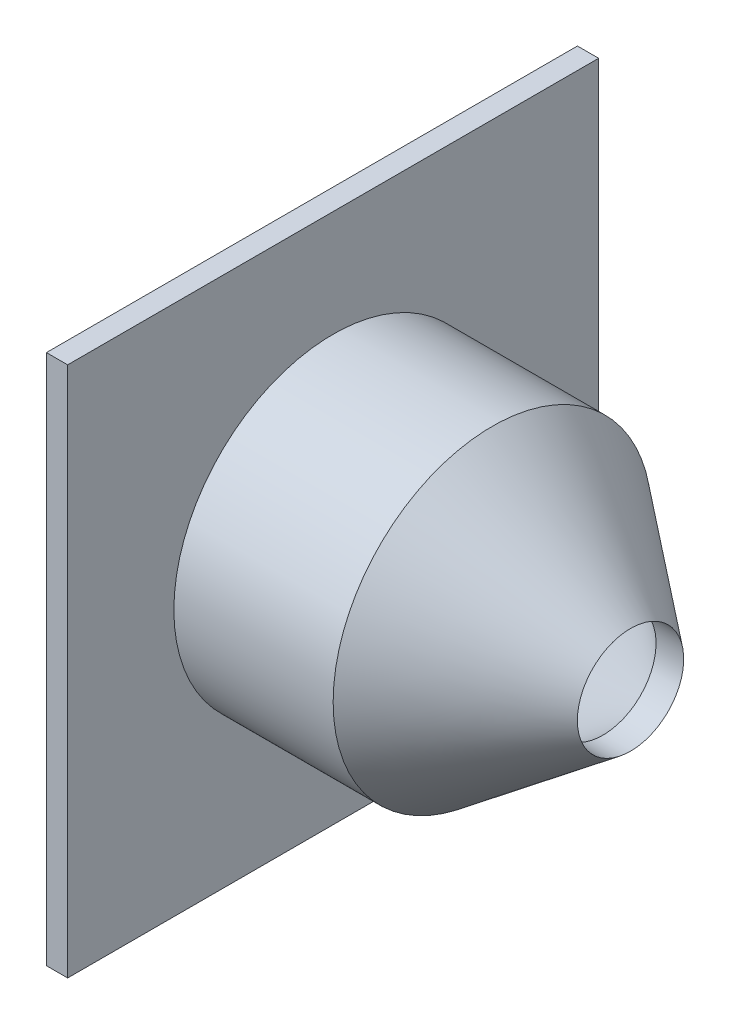
ISO-10303-21;
HEADER;
FILE_DESCRIPTION(('STEP AP214'),'2;1');
FILE_NAME('part.step','',(''),(''),'','','');
FILE_SCHEMA(('AUTOMOTIVE_DESIGN { 1 0 10303 214 1 1 1 1 }'));
ENDSEC;
DATA;
#1=APPLICATION_CONTEXT('core data for automotive mechanical design processes');
#2=APPLICATION_PROTOCOL_DEFINITION('international standard','automotive_design',2000,#1);
#3=PRODUCT_CONTEXT('',#1,'mechanical');
#4=PRODUCT('Part','Part','',(#3));
#5=PRODUCT_RELATED_PRODUCT_CATEGORY('part','',(#4));
#6=PRODUCT_DEFINITION_FORMATION('','',#4);
#7=PRODUCT_DEFINITION_CONTEXT('part definition',#1,'design');
#8=PRODUCT_DEFINITION('design','',#6,#7);
#9=PRODUCT_DEFINITION_SHAPE('','',#8);
#10=(LENGTH_UNIT() NAMED_UNIT(*) SI_UNIT(.MILLI.,.METRE.));
#11=(NAMED_UNIT(*) PLANE_ANGLE_UNIT() SI_UNIT($,.RADIAN.));
#12=(NAMED_UNIT(*) SI_UNIT($,.STERADIAN.) SOLID_ANGLE_UNIT());
#13=UNCERTAINTY_MEASURE_WITH_UNIT(LENGTH_MEASURE(1.E-05),#10,'distance_accuracy_value','');
#14=(GEOMETRIC_REPRESENTATION_CONTEXT(3) GLOBAL_UNCERTAINTY_ASSIGNED_CONTEXT((#13)) GLOBAL_UNIT_ASSIGNED_CONTEXT((#10,
#11,#12)) REPRESENTATION_CONTEXT('',''));
#15=CARTESIAN_POINT('',(0.,0.,0.));
#16=DIRECTION('',(0.,0.,1.));
#17=DIRECTION('',(1.,0.,0.));
#18=AXIS2_PLACEMENT_3D('',#15,#16,#17);
#19=CARTESIAN_POINT('',(2.,0.,-25.));
#20=DIRECTION('',(0.,0.,-1.));
#21=DIRECTION('',(0.,1.,0.));
#22=AXIS2_PLACEMENT_3D('',#19,#20,#21);
#23=PLANE('',#22);
#24=DIRECTION('',(0.,-1.,0.));
#25=VECTOR('',#24,1.);
#26=CARTESIAN_POINT('',(0.,0.,-25.));
#27=LINE('',#26,#25);
#28=CARTESIAN_POINT('',(0.,25.,-25.));
#29=VERTEX_POINT('',#28);
#30=CARTESIAN_POINT('',(0.,-25.,-25.));
#31=VERTEX_POINT('',#30);
#32=EDGE_CURVE('E116',#29,#31,#27,.T.);
#33=ORIENTED_EDGE('',*,*,#32,.F.);
#34=DIRECTION('',(-1.,0.,0.));
#35=VECTOR('',#34,1.);
#36=CARTESIAN_POINT('',(2.,25.,-25.));
#37=LINE('',#36,#35);
#38=CARTESIAN_POINT('',(2.,25.,-25.));
#39=VERTEX_POINT('',#38);
#40=EDGE_CURVE('E12',#39,#29,#37,.T.);
#41=ORIENTED_EDGE('',*,*,#40,.F.);
#42=DIRECTION('',(0.,-1.,0.));
#43=VECTOR('',#42,1.);
#44=CARTESIAN_POINT('',(2.,0.,-25.));
#45=LINE('',#44,#43);
#46=CARTESIAN_POINT('',(2.,-25.,-25.));
#47=VERTEX_POINT('',#46);
#48=EDGE_CURVE('E106',#39,#47,#45,.T.);
#49=ORIENTED_EDGE('',*,*,#48,.T.);
#50=DIRECTION('',(-1.,0.,0.));
#51=VECTOR('',#50,1.);
#52=CARTESIAN_POINT('',(2.,-25.,-25.));
#53=LINE('',#52,#51);
#54=EDGE_CURVE('E85',#47,#31,#53,.T.);
#55=ORIENTED_EDGE('',*,*,#54,.T.);
#56=EDGE_LOOP('',(#33,#41,#49,#55));
#57=FACE_BOUND('',#56,.T.);
#58=ADVANCED_FACE('F45',(#57),#23,.T.);
#59=CARTESIAN_POINT('',(2.,25.,0.));
#60=DIRECTION('',(0.,1.,0.));
#61=DIRECTION('',(0.,0.,1.));
#62=AXIS2_PLACEMENT_3D('',#59,#60,#61);
#63=PLANE('',#62);
#64=DIRECTION('',(0.,0.,-1.));
#65=VECTOR('',#64,1.);
#66=CARTESIAN_POINT('',(0.,25.,0.));
#67=LINE('',#66,#65);
#68=CARTESIAN_POINT('',(0.,25.,25.));
#69=VERTEX_POINT('',#68);
#70=EDGE_CURVE('E97',#69,#29,#67,.T.);
#71=ORIENTED_EDGE('',*,*,#70,.F.);
#72=DIRECTION('',(-1.,0.,0.));
#73=VECTOR('',#72,1.);
#74=CARTESIAN_POINT('',(2.,25.,25.));
#75=LINE('',#74,#73);
#76=CARTESIAN_POINT('',(2.,25.,25.));
#77=VERTEX_POINT('',#76);
#78=EDGE_CURVE('E54',#77,#69,#75,.T.);
#79=ORIENTED_EDGE('',*,*,#78,.F.);
#80=DIRECTION('',(0.,0.,-1.));
#81=VECTOR('',#80,1.);
#82=CARTESIAN_POINT('',(2.,25.,0.));
#83=LINE('',#82,#81);
#84=EDGE_CURVE('E95',#77,#39,#83,.T.);
#85=ORIENTED_EDGE('',*,*,#84,.T.);
#86=ORIENTED_EDGE('',*,*,#40,.T.);
#87=EDGE_LOOP('',(#71,#79,#85,#86));
#88=FACE_BOUND('',#87,.T.);
#89=ADVANCED_FACE('F93',(#88),#63,.T.);
#90=CARTESIAN_POINT('',(2.,0.,25.));
#91=DIRECTION('',(0.,0.,-1.));
#92=DIRECTION('',(-1.,0.,0.));
#93=AXIS2_PLACEMENT_3D('',#90,#91,#92);
#94=PLANE('',#93);
#95=DIRECTION('',(0.,-1.,0.));
#96=VECTOR('',#95,1.);
#97=CARTESIAN_POINT('',(0.,0.,25.));
#98=LINE('',#97,#96);
#99=CARTESIAN_POINT('',(0.,-25.,25.));
#100=VERTEX_POINT('',#99);
#101=EDGE_CURVE('E119',#69,#100,#98,.T.);
#102=ORIENTED_EDGE('',*,*,#101,.T.);
#103=DIRECTION('',(-1.,0.,0.));
#104=VECTOR('',#103,1.);
#105=CARTESIAN_POINT('',(2.,-25.,25.));
#106=LINE('',#105,#104);
#107=CARTESIAN_POINT('',(2.,-25.,25.));
#108=VERTEX_POINT('',#107);
#109=EDGE_CURVE('E100',#108,#100,#106,.T.);
#110=ORIENTED_EDGE('',*,*,#109,.F.);
#111=DIRECTION('',(0.,-1.,0.));
#112=VECTOR('',#111,1.);
#113=CARTESIAN_POINT('',(2.,0.,25.));
#114=LINE('',#113,#112);
#115=EDGE_CURVE('E102',#77,#108,#114,.T.);
#116=ORIENTED_EDGE('',*,*,#115,.F.);
#117=ORIENTED_EDGE('',*,*,#78,.T.);
#118=EDGE_LOOP('',(#102,#110,#116,#117));
#119=FACE_BOUND('',#118,.T.);
#120=ADVANCED_FACE('F103',(#119),#94,.F.);
#121=CARTESIAN_POINT('',(2.,0.,0.));
#122=DIRECTION('',(-1.,0.,0.));
#123=DIRECTION('',(0.,0.,1.));
#124=AXIS2_PLACEMENT_3D('',#121,#122,#123);
#125=CYLINDRICAL_SURFACE('',#124,15.);
#126=CARTESIAN_POINT('',(2.,0.,0.));
#127=DIRECTION('',(1.,0.,0.));
#128=DIRECTION('',(0.,0.,-1.));
#129=AXIS2_PLACEMENT_3D('',#126,#127,#128);
#130=CIRCLE('',#129,15.);
#131=CARTESIAN_POINT('',(2.,0.,-15.));
#132=VERTEX_POINT('',#131);
#133=EDGE_CURVE('E108',#132,#132,#130,.T.);
#134=ORIENTED_EDGE('',*,*,#133,.T.);
#135=EDGE_LOOP('',(#134));
#136=FACE_BOUND('',#135,.T.);
#137=CARTESIAN_POINT('',(0.,0.,0.));
#138=DIRECTION('',(1.,0.,0.));
#139=DIRECTION('',(0.,0.,-1.));
#140=AXIS2_PLACEMENT_3D('',#137,#138,#139);
#141=CIRCLE('',#140,15.);
#142=CARTESIAN_POINT('',(0.,0.,-15.));
#143=VERTEX_POINT('',#142);
#144=EDGE_CURVE('E113',#143,#143,#141,.T.);
#145=ORIENTED_EDGE('',*,*,#144,.F.);
#146=EDGE_LOOP('',(#145));
#147=FACE_BOUND('',#146,.T.);
#148=ADVANCED_FACE('F47',(#136,#147),#125,.F.);
#149=CARTESIAN_POINT('',(2.,-25.,0.));
#150=DIRECTION('',(0.,1.,0.));
#151=DIRECTION('',(0.,0.,1.));
#152=AXIS2_PLACEMENT_3D('',#149,#150,#151);
#153=PLANE('',#152);
#154=DIRECTION('',(0.,0.,-1.));
#155=VECTOR('',#154,1.);
#156=CARTESIAN_POINT('',(0.,-25.,0.));
#157=LINE('',#156,#155);
#158=EDGE_CURVE('E78',#100,#31,#157,.T.);
#159=ORIENTED_EDGE('',*,*,#158,.T.);
#160=ORIENTED_EDGE('',*,*,#54,.F.);
#161=DIRECTION('',(0.,0.,-1.));
#162=VECTOR('',#161,1.);
#163=CARTESIAN_POINT('',(2.,-25.,0.));
#164=LINE('',#163,#162);
#165=EDGE_CURVE('E62',#108,#47,#164,.T.);
#166=ORIENTED_EDGE('',*,*,#165,.F.);
#167=ORIENTED_EDGE('',*,*,#109,.T.);
#168=EDGE_LOOP('',(#159,#160,#166,#167));
#169=FACE_BOUND('',#168,.T.);
#170=ADVANCED_FACE('F124',(#169),#153,.F.);
#171=CARTESIAN_POINT('',(2.,0.,0.));
#172=DIRECTION('',(1.,0.,0.));
#173=DIRECTION('',(0.,0.,-1.));
#174=AXIS2_PLACEMENT_3D('',#171,#172,#173);
#175=PLANE('',#174);
#176=ORIENTED_EDGE('',*,*,#133,.F.);
#177=EDGE_LOOP('',(#176));
#178=FACE_BOUND('',#177,.T.);
#179=ORIENTED_EDGE('',*,*,#48,.F.);
#180=ORIENTED_EDGE('',*,*,#84,.F.);
#181=ORIENTED_EDGE('',*,*,#115,.T.);
#182=ORIENTED_EDGE('',*,*,#165,.T.);
#183=EDGE_LOOP('',(#179,#180,#181,#182));
#184=FACE_BOUND('',#183,.T.);
#185=ADVANCED_FACE('F105',(#178,#184),#175,.T.);
#186=CARTESIAN_POINT('',(0.,0.,0.));
#187=DIRECTION('',(1.,0.,0.));
#188=DIRECTION('',(0.,0.,-1.));
#189=AXIS2_PLACEMENT_3D('',#186,#187,#188);
#190=PLANE('',#189);
#191=ORIENTED_EDGE('',*,*,#144,.T.);
#192=EDGE_LOOP('',(#191));
#193=FACE_BOUND('',#192,.T.);
#194=ORIENTED_EDGE('',*,*,#32,.T.);
#195=ORIENTED_EDGE('',*,*,#158,.F.);
#196=ORIENTED_EDGE('',*,*,#101,.F.);
#197=ORIENTED_EDGE('',*,*,#70,.T.);
#198=EDGE_LOOP('',(#194,#195,#196,#197));
#199=FACE_BOUND('',#198,.T.);
#200=ADVANCED_FACE('F125',(#193,#199),#190,.F.);
#201=CLOSED_SHELL('',(#58,#89,#120,#148,#170,#185,#200));
#202=MANIFOLD_SOLID_BREP('B2',#201);
#203=CARTESIAN_POINT('',(17.,0.,0.));
#204=DIRECTION('',(-1.,0.,0.));
#205=DIRECTION('',(0.,0.,1.));
#206=AXIS2_PLACEMENT_3D('',#203,#204,#205);
#207=CYLINDRICAL_SURFACE('',#206,13.);
#208=CARTESIAN_POINT('',(17.,0.,0.));
#209=DIRECTION('',(-1.,0.,0.));
#210=DIRECTION('',(0.,0.,1.));
#211=AXIS2_PLACEMENT_3D('',#208,#209,#210);
#212=CIRCLE('',#211,13.);
#213=CARTESIAN_POINT('',(17.,0.,13.));
#214=VERTEX_POINT('',#213);
#215=EDGE_CURVE('E213',#214,#214,#212,.T.);
#216=ORIENTED_EDGE('',*,*,#215,.F.);
#217=EDGE_LOOP('',(#216));
#218=FACE_BOUND('',#217,.T.);
#219=CARTESIAN_POINT('',(0.,0.,0.));
#220=DIRECTION('',(1.,0.,0.));
#221=DIRECTION('',(0.,0.,-1.));
#222=AXIS2_PLACEMENT_3D('',#219,#220,#221);
#223=CIRCLE('',#222,13.);
#224=CARTESIAN_POINT('',(0.,0.,-13.));
#225=VERTEX_POINT('',#224);
#226=EDGE_CURVE('E201',#225,#225,#223,.T.);
#227=ORIENTED_EDGE('',*,*,#226,.F.);
#228=EDGE_LOOP('',(#227));
#229=FACE_BOUND('',#228,.T.);
#230=ADVANCED_FACE('F190',(#218,#229),#207,.F.);
#231=CARTESIAN_POINT('',(17.,0.,0.));
#232=DIRECTION('',(-1.,0.,0.));
#233=DIRECTION('',(0.,0.,1.));
#234=AXIS2_PLACEMENT_3D('',#231,#232,#233);
#235=CYLINDRICAL_SURFACE('',#234,15.);
#236=CARTESIAN_POINT('',(17.,0.,0.));
#237=DIRECTION('',(1.,0.,0.));
#238=DIRECTION('',(0.,0.,-1.));
#239=AXIS2_PLACEMENT_3D('',#236,#237,#238);
#240=CIRCLE('',#239,15.);
#241=CARTESIAN_POINT('',(17.,0.,-15.));
#242=VERTEX_POINT('',#241);
#243=EDGE_CURVE('E44',#242,#242,#240,.T.);
#244=ORIENTED_EDGE('',*,*,#243,.F.);
#245=EDGE_LOOP('',(#244));
#246=FACE_BOUND('',#245,.T.);
#247=CARTESIAN_POINT('',(0.,0.,0.));
#248=DIRECTION('',(1.,0.,0.));
#249=DIRECTION('',(0.,0.,-1.));
#250=AXIS2_PLACEMENT_3D('',#247,#248,#249);
#251=CIRCLE('',#250,15.);
#252=CARTESIAN_POINT('',(0.,0.,-15.));
#253=VERTEX_POINT('',#252);
#254=EDGE_CURVE('E193',#253,#253,#251,.T.);
#255=ORIENTED_EDGE('',*,*,#254,.T.);
#256=EDGE_LOOP('',(#255));
#257=FACE_BOUND('',#256,.T.);
#258=ADVANCED_FACE('F224',(#246,#257),#235,.T.);
#259=CARTESIAN_POINT('',(0.,0.,0.));
#260=DIRECTION('',(1.,0.,0.));
#261=DIRECTION('',(0.,0.,-1.));
#262=AXIS2_PLACEMENT_3D('',#259,#260,#261);
#263=PLANE('',#262);
#264=ORIENTED_EDGE('',*,*,#226,.T.);
#265=EDGE_LOOP('',(#264));
#266=FACE_BOUND('',#265,.T.);
#267=ORIENTED_EDGE('',*,*,#254,.F.);
#268=EDGE_LOOP('',(#267));
#269=FACE_BOUND('',#268,.T.);
#270=ADVANCED_FACE('F228',(#266,#269),#263,.F.);
#271=CARTESIAN_POINT('',(17.,0.,0.));
#272=DIRECTION('',(-1.,0.,0.));
#273=DIRECTION('',(0.,0.,1.));
#274=AXIS2_PLACEMENT_3D('',#271,#272,#273);
#275=CONICAL_SURFACE('',#274,13.,0.655388915333844);
#276=CARTESIAN_POINT('',(27.3983492370658,0.,0.));
#277=DIRECTION('',(-1.,0.,0.));
#278=DIRECTION('',(0.,0.,1.));
#279=AXIS2_PLACEMENT_3D('',#276,#277,#278);
#280=CIRCLE('',#279,5.00634505967428);
#281=CARTESIAN_POINT('',(27.3983492370658,0.,5.00634505967428));
#282=VERTEX_POINT('',#281);
#283=EDGE_CURVE('E203',#282,#282,#280,.T.);
#284=ORIENTED_EDGE('',*,*,#283,.F.);
#285=EDGE_LOOP('',(#284));
#286=FACE_BOUND('',#285,.T.);
#287=ORIENTED_EDGE('',*,*,#215,.T.);
#288=EDGE_LOOP('',(#287));
#289=FACE_BOUND('',#288,.T.);
#290=ADVANCED_FACE('F220',(#286,#289),#275,.F.);
#291=CARTESIAN_POINT('',(-1.32201978028119,0.,0.));
#292=DIRECTION('',(-1.,0.,0.));
#293=DIRECTION('',(0.,0.,1.));
#294=AXIS2_PLACEMENT_3D('',#291,#292,#293);
#295=CYLINDRICAL_SURFACE('',#294,5.00634505967428);
#296=CARTESIAN_POINT('',(30.,0.,0.));
#297=DIRECTION('',(-1.,0.,0.));
#298=DIRECTION('',(0.,0.,1.));
#299=AXIS2_PLACEMENT_3D('',#296,#297,#298);
#300=CIRCLE('',#299,5.00634505967428);
#301=CARTESIAN_POINT('',(30.,0.,5.00634505967428));
#302=VERTEX_POINT('',#301);
#303=EDGE_CURVE('E209',#302,#302,#300,.T.);
#304=ORIENTED_EDGE('',*,*,#303,.F.);
#305=EDGE_LOOP('',(#304));
#306=FACE_BOUND('',#305,.T.);
#307=ORIENTED_EDGE('',*,*,#283,.T.);
#308=EDGE_LOOP('',(#307));
#309=FACE_BOUND('',#308,.T.);
#310=ADVANCED_FACE('F238',(#306,#309),#295,.F.);
#311=CARTESIAN_POINT('',(17.,0.,0.));
#312=DIRECTION('',(-1.,0.,0.));
#313=DIRECTION('',(0.,0.,1.));
#314=AXIS2_PLACEMENT_3D('',#311,#312,#313);
#315=CONICAL_SURFACE('',#314,15.,0.655388915333844);
#316=ORIENTED_EDGE('',*,*,#303,.T.);
#317=EDGE_LOOP('',(#316));
#318=FACE_BOUND('',#317,.T.);
#319=ORIENTED_EDGE('',*,*,#243,.T.);
#320=EDGE_LOOP('',(#319));
#321=FACE_BOUND('',#320,.T.);
#322=ADVANCED_FACE('F242',(#318,#321),#315,.T.);
#323=CLOSED_SHELL('',(#230,#258,#270,#290,#310,#322));
#324=MANIFOLD_SOLID_BREP('B6',#323);
#325=ADVANCED_BREP_SHAPE_REPRESENTATION('',(#18,#202,#324),#14);
#326=SHAPE_DEFINITION_REPRESENTATION(#9,#325);
ENDSEC;
END-ISO-10303-21;
